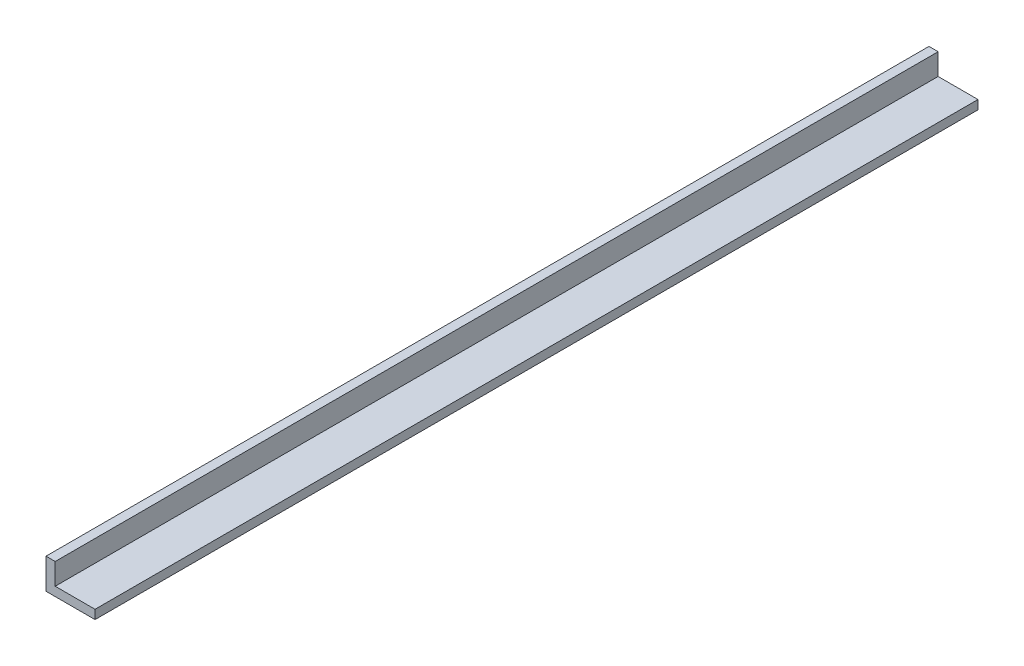
ISO-10303-21;
HEADER;
FILE_DESCRIPTION(('STEP AP214'),'2;1');
FILE_NAME('part.step','',(''),(''),'','','');
FILE_SCHEMA(('AUTOMOTIVE_DESIGN { 1 0 10303 214 1 1 1 1 }'));
ENDSEC;
DATA;
#1=APPLICATION_CONTEXT('core data for automotive mechanical design processes');
#2=APPLICATION_PROTOCOL_DEFINITION('international standard','automotive_design',2000,#1);
#3=PRODUCT_CONTEXT('',#1,'mechanical');
#4=PRODUCT('Part','Part','',(#3));
#5=PRODUCT_RELATED_PRODUCT_CATEGORY('part','',(#4));
#6=PRODUCT_DEFINITION_FORMATION('','',#4);
#7=PRODUCT_DEFINITION_CONTEXT('part definition',#1,'design');
#8=PRODUCT_DEFINITION('design','',#6,#7);
#9=PRODUCT_DEFINITION_SHAPE('','',#8);
#10=(LENGTH_UNIT() NAMED_UNIT(*) SI_UNIT(.MILLI.,.METRE.));
#11=(NAMED_UNIT(*) PLANE_ANGLE_UNIT() SI_UNIT($,.RADIAN.));
#12=(NAMED_UNIT(*) SI_UNIT($,.STERADIAN.) SOLID_ANGLE_UNIT());
#13=UNCERTAINTY_MEASURE_WITH_UNIT(LENGTH_MEASURE(1.E-05),#10,'distance_accuracy_value','');
#14=(GEOMETRIC_REPRESENTATION_CONTEXT(3) GLOBAL_UNCERTAINTY_ASSIGNED_CONTEXT((#13)) GLOBAL_UNIT_ASSIGNED_CONTEXT((#10,
#11,#12)) REPRESENTATION_CONTEXT('',''));
#15=CARTESIAN_POINT('',(0.,0.,0.));
#16=DIRECTION('',(0.,0.,1.));
#17=DIRECTION('',(1.,0.,0.));
#18=AXIS2_PLACEMENT_3D('',#15,#16,#17);
#19=CARTESIAN_POINT('',(100.266859582414,-18.8000361717027,3657.6));
#20=DIRECTION('',(-1.,0.,0.));
#21=DIRECTION('',(0.,0.,1.));
#22=AXIS2_PLACEMENT_3D('',#19,#20,#21);
#23=PLANE('',#22);
#24=DIRECTION('',(0.,1.,0.));
#25=VECTOR('',#24,1.);
#26=CARTESIAN_POINT('',(100.266859582414,-18.8000361717027,0.));
#27=LINE('',#26,#25);
#28=CARTESIAN_POINT('',(100.266859582414,-18.8000361717027,0.));
#29=VERTEX_POINT('',#28);
#30=CARTESIAN_POINT('',(100.266859582414,18.3130581591619,0.));
#31=VERTEX_POINT('',#30);
#32=EDGE_CURVE('E122',#29,#31,#27,.T.);
#33=ORIENTED_EDGE('',*,*,#32,.T.);
#34=DIRECTION('',(0.,0.,-1.));
#35=VECTOR('',#34,1.);
#36=CARTESIAN_POINT('',(100.266859582414,18.3130581591619,3657.6));
#37=LINE('',#36,#35);
#38=CARTESIAN_POINT('',(100.266859582414,18.3130581591619,3657.6));
#39=VERTEX_POINT('',#38);
#40=EDGE_CURVE('E11',#39,#31,#37,.T.);
#41=ORIENTED_EDGE('',*,*,#40,.F.);
#42=DIRECTION('',(0.,1.,0.));
#43=VECTOR('',#42,1.);
#44=CARTESIAN_POINT('',(100.266859582414,-18.8000361717027,3657.6));
#45=LINE('',#44,#43);
#46=CARTESIAN_POINT('',(100.266859582414,-18.8000361717027,3657.6));
#47=VERTEX_POINT('',#46);
#48=EDGE_CURVE('E132',#47,#39,#45,.T.);
#49=ORIENTED_EDGE('',*,*,#48,.F.);
#50=DIRECTION('',(0.,0.,-1.));
#51=VECTOR('',#50,1.);
#52=CARTESIAN_POINT('',(100.266859582414,-18.8000361717027,3657.6));
#53=LINE('',#52,#51);
#54=EDGE_CURVE('E118',#47,#29,#53,.T.);
#55=ORIENTED_EDGE('',*,*,#54,.T.);
#56=EDGE_LOOP('',(#33,#41,#49,#55));
#57=FACE_BOUND('',#56,.T.);
#58=ADVANCED_FACE('F36',(#57),#23,.F.);
#59=CARTESIAN_POINT('',(-64.8459244888751,18.3130581591619,3657.6));
#60=DIRECTION('',(0.,-1.,0.));
#61=DIRECTION('',(0.,0.,-1.));
#62=AXIS2_PLACEMENT_3D('',#59,#60,#61);
#63=PLANE('',#62);
#64=DIRECTION('',(-1.,0.,0.));
#65=VECTOR('',#64,1.);
#66=CARTESIAN_POINT('',(-64.8459244888751,18.3130581591619,0.));
#67=LINE('',#66,#65);
#68=CARTESIAN_POINT('',(-64.8459244888751,18.3130581591619,0.));
#69=VERTEX_POINT('',#68);
#70=EDGE_CURVE('E125',#31,#69,#67,.T.);
#71=ORIENTED_EDGE('',*,*,#70,.T.);
#72=DIRECTION('',(0.,0.,-1.));
#73=VECTOR('',#72,1.);
#74=CARTESIAN_POINT('',(-64.8459244888751,18.3130581591619,3657.6));
#75=LINE('',#74,#73);
#76=CARTESIAN_POINT('',(-64.8459244888751,18.3130581591619,3657.6));
#77=VERTEX_POINT('',#76);
#78=EDGE_CURVE('E45',#77,#69,#75,.T.);
#79=ORIENTED_EDGE('',*,*,#78,.F.);
#80=DIRECTION('',(-1.,0.,0.));
#81=VECTOR('',#80,1.);
#82=CARTESIAN_POINT('',(-64.8459244888751,18.3130581591619,3657.6));
#83=LINE('',#82,#81);
#84=EDGE_CURVE('E89',#39,#77,#83,.T.);
#85=ORIENTED_EDGE('',*,*,#84,.F.);
#86=ORIENTED_EDGE('',*,*,#40,.T.);
#87=EDGE_LOOP('',(#71,#79,#85,#86));
#88=FACE_BOUND('',#87,.T.);
#89=ADVANCED_FACE('F160',(#88),#63,.F.);
#90=CARTESIAN_POINT('',(-64.8459244888751,18.3130581591619,3657.6));
#91=DIRECTION('',(-1.,0.,0.));
#92=DIRECTION('',(0.,0.,1.));
#93=AXIS2_PLACEMENT_3D('',#90,#91,#92);
#94=PLANE('',#93);
#95=DIRECTION('',(0.,1.,0.));
#96=VECTOR('',#95,1.);
#97=CARTESIAN_POINT('',(-64.8459244888751,18.3130581591619,0.));
#98=LINE('',#97,#96);
#99=CARTESIAN_POINT('',(-64.8459244888751,107.213058159162,0.));
#100=VERTEX_POINT('',#99);
#101=EDGE_CURVE('E127',#69,#100,#98,.T.);
#102=ORIENTED_EDGE('',*,*,#101,.T.);
#103=DIRECTION('',(0.,0.,-1.));
#104=VECTOR('',#103,1.);
#105=CARTESIAN_POINT('',(-64.8459244888751,107.213058159162,3657.6));
#106=LINE('',#105,#104);
#107=CARTESIAN_POINT('',(-64.8459244888751,107.213058159162,3657.6));
#108=VERTEX_POINT('',#107);
#109=EDGE_CURVE('E113',#108,#100,#106,.T.);
#110=ORIENTED_EDGE('',*,*,#109,.F.);
#111=DIRECTION('',(0.,1.,0.));
#112=VECTOR('',#111,1.);
#113=CARTESIAN_POINT('',(-64.8459244888751,18.3130581591619,3657.6));
#114=LINE('',#113,#112);
#115=EDGE_CURVE('E102',#77,#108,#114,.T.);
#116=ORIENTED_EDGE('',*,*,#115,.F.);
#117=ORIENTED_EDGE('',*,*,#78,.T.);
#118=EDGE_LOOP('',(#102,#110,#116,#117));
#119=FACE_BOUND('',#118,.T.);
#120=ADVANCED_FACE('F142',(#119),#94,.F.);
#121=CARTESIAN_POINT('',(-102.933140417586,107.213058159162,3657.6));
#122=DIRECTION('',(0.,-1.,0.));
#123=DIRECTION('',(0.,0.,-1.));
#124=AXIS2_PLACEMENT_3D('',#121,#122,#123);
#125=PLANE('',#124);
#126=DIRECTION('',(-1.,0.,0.));
#127=VECTOR('',#126,1.);
#128=CARTESIAN_POINT('',(-102.933140417586,107.213058159162,0.));
#129=LINE('',#128,#127);
#130=CARTESIAN_POINT('',(-102.933140417586,107.213058159162,0.));
#131=VERTEX_POINT('',#130);
#132=EDGE_CURVE('E111',#100,#131,#129,.T.);
#133=ORIENTED_EDGE('',*,*,#132,.T.);
#134=DIRECTION('',(0.,0.,-1.));
#135=VECTOR('',#134,1.);
#136=CARTESIAN_POINT('',(-102.933140417586,107.213058159162,3657.6));
#137=LINE('',#136,#135);
#138=CARTESIAN_POINT('',(-102.933140417586,107.213058159162,3657.6));
#139=VERTEX_POINT('',#138);
#140=EDGE_CURVE('E108',#139,#131,#137,.T.);
#141=ORIENTED_EDGE('',*,*,#140,.F.);
#142=DIRECTION('',(-1.,0.,0.));
#143=VECTOR('',#142,1.);
#144=CARTESIAN_POINT('',(-102.933140417586,107.213058159162,3657.6));
#145=LINE('',#144,#143);
#146=EDGE_CURVE('E96',#108,#139,#145,.T.);
#147=ORIENTED_EDGE('',*,*,#146,.F.);
#148=ORIENTED_EDGE('',*,*,#109,.T.);
#149=EDGE_LOOP('',(#133,#141,#147,#148));
#150=FACE_BOUND('',#149,.T.);
#151=ADVANCED_FACE('F109',(#150),#125,.F.);
#152=CARTESIAN_POINT('',(-102.933140417586,-18.8000361717027,3657.6));
#153=DIRECTION('',(1.,0.,0.));
#154=DIRECTION('',(0.,0.,-1.));
#155=AXIS2_PLACEMENT_3D('',#152,#153,#154);
#156=PLANE('',#155);
#157=DIRECTION('',(0.,-1.,0.));
#158=VECTOR('',#157,1.);
#159=CARTESIAN_POINT('',(-102.933140417586,-18.8000361717027,0.));
#160=LINE('',#159,#158);
#161=CARTESIAN_POINT('',(-102.933140417586,-18.8000361717027,0.));
#162=VERTEX_POINT('',#161);
#163=EDGE_CURVE('E75',#131,#162,#160,.T.);
#164=ORIENTED_EDGE('',*,*,#163,.T.);
#165=DIRECTION('',(0.,0.,-1.));
#166=VECTOR('',#165,1.);
#167=CARTESIAN_POINT('',(-102.933140417586,-18.8000361717027,3657.6));
#168=LINE('',#167,#166);
#169=CARTESIAN_POINT('',(-102.933140417586,-18.8000361717027,3657.6));
#170=VERTEX_POINT('',#169);
#171=EDGE_CURVE('E114',#170,#162,#168,.T.);
#172=ORIENTED_EDGE('',*,*,#171,.F.);
#173=DIRECTION('',(0.,-1.,0.));
#174=VECTOR('',#173,1.);
#175=CARTESIAN_POINT('',(-102.933140417586,19.2999638282973,3657.6));
#176=LINE('',#175,#174);
#177=EDGE_CURVE('E100',#139,#170,#176,.T.);
#178=ORIENTED_EDGE('',*,*,#177,.F.);
#179=ORIENTED_EDGE('',*,*,#140,.T.);
#180=EDGE_LOOP('',(#164,#172,#178,#179));
#181=FACE_BOUND('',#180,.T.);
#182=ADVANCED_FACE('F116',(#181),#156,.F.);
#183=CARTESIAN_POINT('',(-102.933140417586,-18.8000361717027,3657.6));
#184=DIRECTION('',(0.,1.,0.));
#185=DIRECTION('',(0.,0.,1.));
#186=AXIS2_PLACEMENT_3D('',#183,#184,#185);
#187=PLANE('',#186);
#188=DIRECTION('',(1.,0.,0.));
#189=VECTOR('',#188,1.);
#190=CARTESIAN_POINT('',(-102.933140417586,-18.8000361717027,0.));
#191=LINE('',#190,#189);
#192=EDGE_CURVE('E81',#162,#29,#191,.T.);
#193=ORIENTED_EDGE('',*,*,#192,.T.);
#194=ORIENTED_EDGE('',*,*,#54,.F.);
#195=DIRECTION('',(1.,0.,0.));
#196=VECTOR('',#195,1.);
#197=CARTESIAN_POINT('',(-102.933140417586,-18.8000361717027,3657.6));
#198=LINE('',#197,#196);
#199=EDGE_CURVE('E53',#170,#47,#198,.T.);
#200=ORIENTED_EDGE('',*,*,#199,.F.);
#201=ORIENTED_EDGE('',*,*,#171,.T.);
#202=EDGE_LOOP('',(#193,#194,#200,#201));
#203=FACE_BOUND('',#202,.T.);
#204=ADVANCED_FACE('F149',(#203),#187,.F.);
#205=CARTESIAN_POINT('',(0.,0.,3657.6));
#206=DIRECTION('',(0.,0.,-1.));
#207=DIRECTION('',(-1.,0.,0.));
#208=AXIS2_PLACEMENT_3D('',#205,#206,#207);
#209=PLANE('',#208);
#210=ORIENTED_EDGE('',*,*,#48,.T.);
#211=ORIENTED_EDGE('',*,*,#84,.T.);
#212=ORIENTED_EDGE('',*,*,#115,.T.);
#213=ORIENTED_EDGE('',*,*,#146,.T.);
#214=ORIENTED_EDGE('',*,*,#177,.T.);
#215=ORIENTED_EDGE('',*,*,#199,.T.);
#216=EDGE_LOOP('',(#210,#211,#212,#213,#214,#215));
#217=FACE_BOUND('',#216,.T.);
#218=ADVANCED_FACE('F98',(#217),#209,.F.);
#219=CARTESIAN_POINT('',(0.,0.,0.));
#220=DIRECTION('',(0.,0.,-1.));
#221=DIRECTION('',(-1.,0.,0.));
#222=AXIS2_PLACEMENT_3D('',#219,#220,#221);
#223=PLANE('',#222);
#224=ORIENTED_EDGE('',*,*,#32,.F.);
#225=ORIENTED_EDGE('',*,*,#192,.F.);
#226=ORIENTED_EDGE('',*,*,#163,.F.);
#227=ORIENTED_EDGE('',*,*,#132,.F.);
#228=ORIENTED_EDGE('',*,*,#101,.F.);
#229=ORIENTED_EDGE('',*,*,#70,.F.);
#230=EDGE_LOOP('',(#224,#225,#226,#227,#228,#229));
#231=FACE_BOUND('',#230,.T.);
#232=ADVANCED_FACE('F145',(#231),#223,.T.);
#233=CLOSED_SHELL('',(#58,#89,#120,#151,#182,#204,#218,#232));
#234=MANIFOLD_SOLID_BREP('B2',#233);
#235=ADVANCED_BREP_SHAPE_REPRESENTATION('',(#18,#234),#14);
#236=SHAPE_DEFINITION_REPRESENTATION(#9,#235);
ENDSEC;
END-ISO-10303-21;
